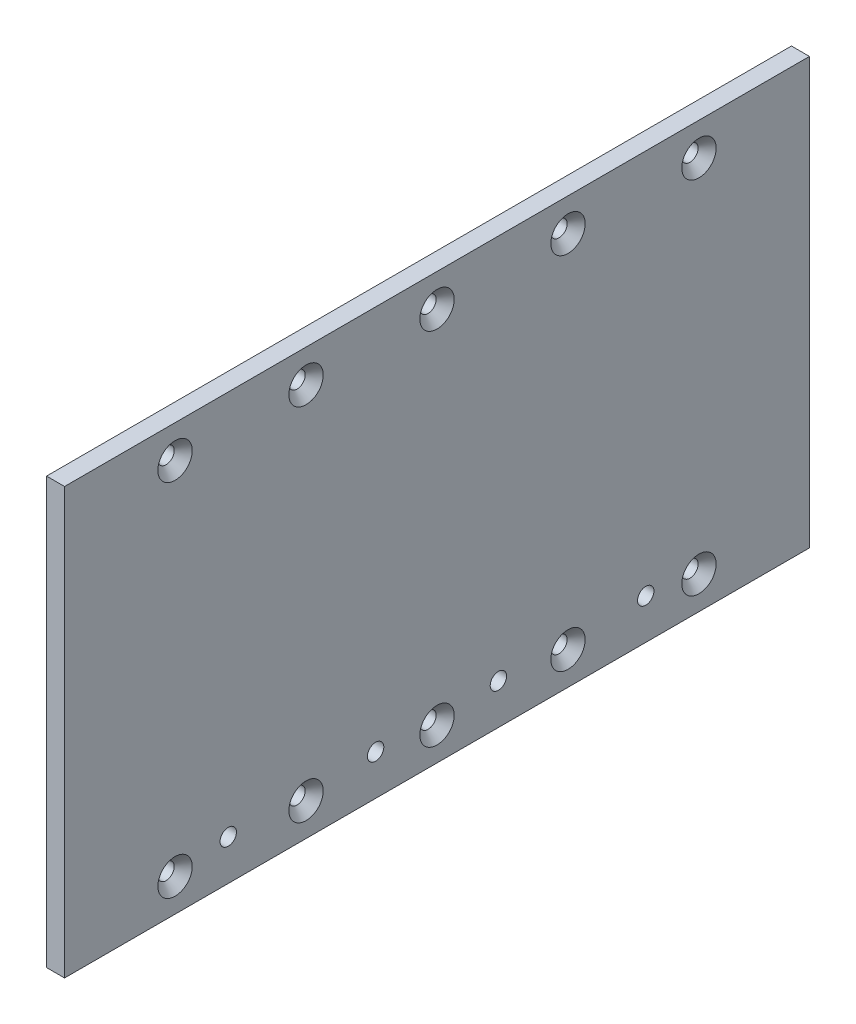
ISO-10303-21;
HEADER;
FILE_DESCRIPTION(('STEP AP214'),'2;1');
FILE_NAME('part.step','',(''),(''),'','','');
FILE_SCHEMA(('AUTOMOTIVE_DESIGN { 1 0 10303 214 1 1 1 1 }'));
ENDSEC;
DATA;
#1=APPLICATION_CONTEXT('core data for automotive mechanical design processes');
#2=APPLICATION_PROTOCOL_DEFINITION('international standard','automotive_design',2000,#1);
#3=PRODUCT_CONTEXT('',#1,'mechanical');
#4=PRODUCT('Part','Part','',(#3));
#5=PRODUCT_RELATED_PRODUCT_CATEGORY('part','',(#4));
#6=PRODUCT_DEFINITION_FORMATION('','',#4);
#7=PRODUCT_DEFINITION_CONTEXT('part definition',#1,'design');
#8=PRODUCT_DEFINITION('design','',#6,#7);
#9=PRODUCT_DEFINITION_SHAPE('','',#8);
#10=(LENGTH_UNIT() NAMED_UNIT(*) SI_UNIT(.MILLI.,.METRE.));
#11=(NAMED_UNIT(*) PLANE_ANGLE_UNIT() SI_UNIT($,.RADIAN.));
#12=(NAMED_UNIT(*) SI_UNIT($,.STERADIAN.) SOLID_ANGLE_UNIT());
#13=UNCERTAINTY_MEASURE_WITH_UNIT(LENGTH_MEASURE(1.E-05),#10,'distance_accuracy_value','');
#14=(GEOMETRIC_REPRESENTATION_CONTEXT(3) GLOBAL_UNCERTAINTY_ASSIGNED_CONTEXT((#13)) GLOBAL_UNIT_ASSIGNED_CONTEXT((#10,
#11,#12)) REPRESENTATION_CONTEXT('',''));
#15=CARTESIAN_POINT('',(0.,0.,0.));
#16=DIRECTION('',(0.,0.,1.));
#17=DIRECTION('',(1.,0.,0.));
#18=AXIS2_PLACEMENT_3D('',#15,#16,#17);
#19=CARTESIAN_POINT('',(5.5,-65.,113.75));
#20=DIRECTION('',(0.,0.,-1.));
#21=DIRECTION('',(-1.,0.,0.));
#22=AXIS2_PLACEMENT_3D('',#19,#20,#21);
#23=PLANE('',#22);
#24=DIRECTION('',(0.,-1.,0.));
#25=VECTOR('',#24,1.);
#26=CARTESIAN_POINT('',(0.,-65.,113.75));
#27=LINE('',#26,#25);
#28=CARTESIAN_POINT('',(0.,65.,113.75));
#29=VERTEX_POINT('',#28);
#30=CARTESIAN_POINT('',(0.,-65.,113.75));
#31=VERTEX_POINT('',#30);
#32=EDGE_CURVE('E108',#29,#31,#27,.T.);
#33=ORIENTED_EDGE('',*,*,#32,.T.);
#34=DIRECTION('',(-1.,0.,0.));
#35=VECTOR('',#34,1.);
#36=CARTESIAN_POINT('',(5.5,-65.,113.75));
#37=LINE('',#36,#35);
#38=CARTESIAN_POINT('',(5.5,-65.,113.75));
#39=VERTEX_POINT('',#38);
#40=EDGE_CURVE('E13',#39,#31,#37,.T.);
#41=ORIENTED_EDGE('',*,*,#40,.F.);
#42=DIRECTION('',(0.,-1.,0.));
#43=VECTOR('',#42,1.);
#44=CARTESIAN_POINT('',(5.5,-65.,113.75));
#45=LINE('',#44,#43);
#46=CARTESIAN_POINT('',(5.5,65.,113.75));
#47=VERTEX_POINT('',#46);
#48=EDGE_CURVE('E96',#47,#39,#45,.T.);
#49=ORIENTED_EDGE('',*,*,#48,.F.);
#50=DIRECTION('',(-1.,0.,0.));
#51=VECTOR('',#50,1.);
#52=CARTESIAN_POINT('',(5.5,65.,113.75));
#53=LINE('',#52,#51);
#54=EDGE_CURVE('E104',#47,#29,#53,.T.);
#55=ORIENTED_EDGE('',*,*,#54,.T.);
#56=EDGE_LOOP('',(#33,#41,#49,#55));
#57=FACE_BOUND('',#56,.T.);
#58=ADVANCED_FACE('F45',(#57),#23,.F.);
#59=CARTESIAN_POINT('',(5.5,-65.,-113.75));
#60=DIRECTION('',(0.,1.,0.));
#61=DIRECTION('',(0.,0.,1.));
#62=AXIS2_PLACEMENT_3D('',#59,#60,#61);
#63=PLANE('',#62);
#64=DIRECTION('',(0.,0.,-1.));
#65=VECTOR('',#64,1.);
#66=CARTESIAN_POINT('',(0.,-65.,-113.75));
#67=LINE('',#66,#65);
#68=CARTESIAN_POINT('',(0.,-65.,-113.75));
#69=VERTEX_POINT('',#68);
#70=EDGE_CURVE('E100',#31,#69,#67,.T.);
#71=ORIENTED_EDGE('',*,*,#70,.T.);
#72=DIRECTION('',(-1.,0.,0.));
#73=VECTOR('',#72,1.);
#74=CARTESIAN_POINT('',(5.5,-65.,-113.75));
#75=LINE('',#74,#73);
#76=CARTESIAN_POINT('',(5.5,-65.,-113.75));
#77=VERTEX_POINT('',#76);
#78=EDGE_CURVE('E53',#77,#69,#75,.T.);
#79=ORIENTED_EDGE('',*,*,#78,.F.);
#80=DIRECTION('',(0.,0.,-1.));
#81=VECTOR('',#80,1.);
#82=CARTESIAN_POINT('',(5.5,-65.,-113.75));
#83=LINE('',#82,#81);
#84=EDGE_CURVE('E91',#39,#77,#83,.T.);
#85=ORIENTED_EDGE('',*,*,#84,.F.);
#86=ORIENTED_EDGE('',*,*,#40,.T.);
#87=EDGE_LOOP('',(#71,#79,#85,#86));
#88=FACE_BOUND('',#87,.T.);
#89=ADVANCED_FACE('F99',(#88),#63,.F.);
#90=CARTESIAN_POINT('',(5.5,-65.,-113.75));
#91=DIRECTION('',(0.,0.,1.));
#92=DIRECTION('',(1.,0.,0.));
#93=AXIS2_PLACEMENT_3D('',#90,#91,#92);
#94=PLANE('',#93);
#95=DIRECTION('',(0.,1.,0.));
#96=VECTOR('',#95,1.);
#97=CARTESIAN_POINT('',(0.,-65.,-113.75));
#98=LINE('',#97,#96);
#99=CARTESIAN_POINT('',(0.,65.,-113.75));
#100=VERTEX_POINT('',#99);
#101=EDGE_CURVE('E78',#69,#100,#98,.T.);
#102=ORIENTED_EDGE('',*,*,#101,.T.);
#103=DIRECTION('',(-1.,0.,0.));
#104=VECTOR('',#103,1.);
#105=CARTESIAN_POINT('',(5.5,65.,-113.75));
#106=LINE('',#105,#104);
#107=CARTESIAN_POINT('',(5.5,65.,-113.75));
#108=VERTEX_POINT('',#107);
#109=EDGE_CURVE('E101',#108,#100,#106,.T.);
#110=ORIENTED_EDGE('',*,*,#109,.F.);
#111=DIRECTION('',(0.,1.,0.));
#112=VECTOR('',#111,1.);
#113=CARTESIAN_POINT('',(5.5,-65.,-113.75));
#114=LINE('',#113,#112);
#115=EDGE_CURVE('E94',#77,#108,#114,.T.);
#116=ORIENTED_EDGE('',*,*,#115,.F.);
#117=ORIENTED_EDGE('',*,*,#78,.T.);
#118=EDGE_LOOP('',(#102,#110,#116,#117));
#119=FACE_BOUND('',#118,.T.);
#120=ADVANCED_FACE('F102',(#119),#94,.F.);
#121=CARTESIAN_POINT('',(5.5,65.,-113.75));
#122=DIRECTION('',(0.,-1.,0.));
#123=DIRECTION('',(0.,0.,-1.));
#124=AXIS2_PLACEMENT_3D('',#121,#122,#123);
#125=PLANE('',#124);
#126=DIRECTION('',(0.,0.,1.));
#127=VECTOR('',#126,1.);
#128=CARTESIAN_POINT('',(0.,65.,-113.75));
#129=LINE('',#128,#127);
#130=EDGE_CURVE('E84',#100,#29,#129,.T.);
#131=ORIENTED_EDGE('',*,*,#130,.T.);
#132=ORIENTED_EDGE('',*,*,#54,.F.);
#133=DIRECTION('',(0.,0.,1.));
#134=VECTOR('',#133,1.);
#135=CARTESIAN_POINT('',(5.5,65.,-113.75));
#136=LINE('',#135,#134);
#137=EDGE_CURVE('E61',#108,#47,#136,.T.);
#138=ORIENTED_EDGE('',*,*,#137,.F.);
#139=ORIENTED_EDGE('',*,*,#109,.T.);
#140=EDGE_LOOP('',(#131,#132,#138,#139));
#141=FACE_BOUND('',#140,.T.);
#142=ADVANCED_FACE('F116',(#141),#125,.F.);
#143=CARTESIAN_POINT('',(5.5,0.,0.));
#144=DIRECTION('',(1.,0.,0.));
#145=DIRECTION('',(0.,0.,-1.));
#146=AXIS2_PLACEMENT_3D('',#143,#144,#145);
#147=PLANE('',#146);
#148=CARTESIAN_POINT('',(5.5,-52.6538368417559,63.75));
#149=DIRECTION('',(1.,0.,0.));
#150=DIRECTION('',(0.,0.,-1.));
#151=AXIS2_PLACEMENT_3D('',#148,#149,#150);
#152=CIRCLE('',#151,2.49999999999999);
#153=CARTESIAN_POINT('',(5.5,-52.6538368417559,61.25));
#154=VERTEX_POINT('',#153);
#155=EDGE_CURVE('E232',#154,#154,#152,.T.);
#156=ORIENTED_EDGE('',*,*,#155,.F.);
#157=EDGE_LOOP('',(#156));
#158=FACE_BOUND('',#157,.T.);
#159=CARTESIAN_POINT('',(5.5,-52.6538368417559,18.75));
#160=DIRECTION('',(1.,0.,0.));
#161=DIRECTION('',(0.,0.,-1.));
#162=AXIS2_PLACEMENT_3D('',#159,#160,#161);
#163=CIRCLE('',#162,2.49999999999999);
#164=CARTESIAN_POINT('',(5.5,-52.6538368417559,16.2500000000001));
#165=VERTEX_POINT('',#164);
#166=EDGE_CURVE('E226',#165,#165,#163,.T.);
#167=ORIENTED_EDGE('',*,*,#166,.F.);
#168=EDGE_LOOP('',(#167));
#169=FACE_BOUND('',#168,.T.);
#170=CARTESIAN_POINT('',(5.5,-52.6538368417559,-18.75));
#171=DIRECTION('',(1.,0.,0.));
#172=DIRECTION('',(0.,0.,-1.));
#173=AXIS2_PLACEMENT_3D('',#170,#171,#172);
#174=CIRCLE('',#173,2.49999999999999);
#175=CARTESIAN_POINT('',(5.5,-52.6538368417559,-21.25));
#176=VERTEX_POINT('',#175);
#177=EDGE_CURVE('E220',#176,#176,#174,.T.);
#178=ORIENTED_EDGE('',*,*,#177,.F.);
#179=EDGE_LOOP('',(#178));
#180=FACE_BOUND('',#179,.T.);
#181=CARTESIAN_POINT('',(5.5,-52.6538368417559,-63.75));
#182=DIRECTION('',(1.,0.,0.));
#183=DIRECTION('',(0.,0.,-1.));
#184=AXIS2_PLACEMENT_3D('',#181,#182,#183);
#185=CIRCLE('',#184,2.49999999999999);
#186=CARTESIAN_POINT('',(5.5,-52.6538368417559,-66.2499999999999));
#187=VERTEX_POINT('',#186);
#188=EDGE_CURVE('E214',#187,#187,#185,.T.);
#189=ORIENTED_EDGE('',*,*,#188,.F.);
#190=EDGE_LOOP('',(#189));
#191=FACE_BOUND('',#190,.T.);
#192=CARTESIAN_POINT('',(5.5,55.,-80.));
#193=DIRECTION('',(1.,0.,0.));
#194=DIRECTION('',(0.,0.,-1.));
#195=AXIS2_PLACEMENT_3D('',#192,#193,#194);
#196=CIRCLE('',#195,5.25);
#197=CARTESIAN_POINT('',(5.5,55.,-85.25));
#198=VERTEX_POINT('',#197);
#199=EDGE_CURVE('E208',#198,#198,#196,.T.);
#200=ORIENTED_EDGE('',*,*,#199,.F.);
#201=EDGE_LOOP('',(#200));
#202=FACE_BOUND('',#201,.T.);
#203=CARTESIAN_POINT('',(5.5,55.,-40.));
#204=DIRECTION('',(1.,0.,0.));
#205=DIRECTION('',(0.,0.,-1.));
#206=AXIS2_PLACEMENT_3D('',#203,#204,#205);
#207=CIRCLE('',#206,5.25);
#208=CARTESIAN_POINT('',(5.5,55.,-45.25));
#209=VERTEX_POINT('',#208);
#210=EDGE_CURVE('E199',#209,#209,#207,.T.);
#211=ORIENTED_EDGE('',*,*,#210,.F.);
#212=EDGE_LOOP('',(#211));
#213=FACE_BOUND('',#212,.T.);
#214=CARTESIAN_POINT('',(5.5,55.,0.));
#215=DIRECTION('',(1.,0.,0.));
#216=DIRECTION('',(0.,0.,-1.));
#217=AXIS2_PLACEMENT_3D('',#214,#215,#216);
#218=CIRCLE('',#217,5.25);
#219=CARTESIAN_POINT('',(5.5,55.,-5.25));
#220=VERTEX_POINT('',#219);
#221=EDGE_CURVE('E190',#220,#220,#218,.T.);
#222=ORIENTED_EDGE('',*,*,#221,.F.);
#223=EDGE_LOOP('',(#222));
#224=FACE_BOUND('',#223,.T.);
#225=CARTESIAN_POINT('',(5.5,54.9999999999999,40.));
#226=DIRECTION('',(1.,0.,0.));
#227=DIRECTION('',(0.,0.,-1.));
#228=AXIS2_PLACEMENT_3D('',#225,#226,#227);
#229=CIRCLE('',#228,5.25);
#230=CARTESIAN_POINT('',(5.5,54.9999999999999,34.75));
#231=VERTEX_POINT('',#230);
#232=EDGE_CURVE('E181',#231,#231,#229,.T.);
#233=ORIENTED_EDGE('',*,*,#232,.F.);
#234=EDGE_LOOP('',(#233));
#235=FACE_BOUND('',#234,.T.);
#236=CARTESIAN_POINT('',(5.5,54.9999999999999,80.));
#237=DIRECTION('',(1.,0.,0.));
#238=DIRECTION('',(0.,0.,-1.));
#239=AXIS2_PLACEMENT_3D('',#236,#237,#238);
#240=CIRCLE('',#239,5.25);
#241=CARTESIAN_POINT('',(5.5,54.9999999999999,74.75));
#242=VERTEX_POINT('',#241);
#243=EDGE_CURVE('E172',#242,#242,#240,.T.);
#244=ORIENTED_EDGE('',*,*,#243,.F.);
#245=EDGE_LOOP('',(#244));
#246=FACE_BOUND('',#245,.T.);
#247=CARTESIAN_POINT('',(5.5,-55.0000000000001,80.));
#248=DIRECTION('',(1.,0.,0.));
#249=DIRECTION('',(0.,0.,-1.));
#250=AXIS2_PLACEMENT_3D('',#247,#248,#249);
#251=CIRCLE('',#250,5.25);
#252=CARTESIAN_POINT('',(5.5,-55.0000000000001,74.75));
#253=VERTEX_POINT('',#252);
#254=EDGE_CURVE('E163',#253,#253,#251,.T.);
#255=ORIENTED_EDGE('',*,*,#254,.F.);
#256=EDGE_LOOP('',(#255));
#257=FACE_BOUND('',#256,.T.);
#258=CARTESIAN_POINT('',(5.5,-55.0000000000001,40.));
#259=DIRECTION('',(1.,0.,0.));
#260=DIRECTION('',(0.,0.,-1.));
#261=AXIS2_PLACEMENT_3D('',#258,#259,#260);
#262=CIRCLE('',#261,5.25);
#263=CARTESIAN_POINT('',(5.5,-55.0000000000001,34.75));
#264=VERTEX_POINT('',#263);
#265=EDGE_CURVE('E154',#264,#264,#262,.T.);
#266=ORIENTED_EDGE('',*,*,#265,.F.);
#267=EDGE_LOOP('',(#266));
#268=FACE_BOUND('',#267,.T.);
#269=CARTESIAN_POINT('',(5.5,-55.0000000000001,0.));
#270=DIRECTION('',(1.,0.,0.));
#271=DIRECTION('',(0.,0.,-1.));
#272=AXIS2_PLACEMENT_3D('',#269,#270,#271);
#273=CIRCLE('',#272,5.25);
#274=CARTESIAN_POINT('',(5.5,-55.0000000000001,-5.25000000000001));
#275=VERTEX_POINT('',#274);
#276=EDGE_CURVE('E145',#275,#275,#273,.T.);
#277=ORIENTED_EDGE('',*,*,#276,.F.);
#278=EDGE_LOOP('',(#277));
#279=FACE_BOUND('',#278,.T.);
#280=CARTESIAN_POINT('',(5.5,-55.,-40.));
#281=DIRECTION('',(1.,0.,0.));
#282=DIRECTION('',(0.,0.,-1.));
#283=AXIS2_PLACEMENT_3D('',#280,#281,#282);
#284=CIRCLE('',#283,5.25);
#285=CARTESIAN_POINT('',(5.5,-55.,-45.25));
#286=VERTEX_POINT('',#285);
#287=EDGE_CURVE('E136',#286,#286,#284,.T.);
#288=ORIENTED_EDGE('',*,*,#287,.F.);
#289=EDGE_LOOP('',(#288));
#290=FACE_BOUND('',#289,.T.);
#291=CARTESIAN_POINT('',(5.5,-55.,-80.));
#292=DIRECTION('',(1.,0.,0.));
#293=DIRECTION('',(0.,0.,-1.));
#294=AXIS2_PLACEMENT_3D('',#291,#292,#293);
#295=CIRCLE('',#294,5.25);
#296=CARTESIAN_POINT('',(5.5,-55.,-85.25));
#297=VERTEX_POINT('',#296);
#298=EDGE_CURVE('E127',#297,#297,#295,.T.);
#299=ORIENTED_EDGE('',*,*,#298,.F.);
#300=EDGE_LOOP('',(#299));
#301=FACE_BOUND('',#300,.T.);
#302=ORIENTED_EDGE('',*,*,#48,.T.);
#303=ORIENTED_EDGE('',*,*,#84,.T.);
#304=ORIENTED_EDGE('',*,*,#115,.T.);
#305=ORIENTED_EDGE('',*,*,#137,.T.);
#306=EDGE_LOOP('',(#302,#303,#304,#305));
#307=FACE_BOUND('',#306,.T.);
#308=ADVANCED_FACE('F92',(#158,#169,#180,#191,#202,#213,#224,#235,#246,#257,#268,#279,#290,#301,
#307),#147,.T.);
#309=CARTESIAN_POINT('',(0.,0.,0.));
#310=DIRECTION('',(1.,0.,0.));
#311=DIRECTION('',(0.,0.,-1.));
#312=AXIS2_PLACEMENT_3D('',#309,#310,#311);
#313=PLANE('',#312);
#314=CARTESIAN_POINT('',(0.,-52.6538368417559,63.75));
#315=DIRECTION('',(1.,0.,0.));
#316=DIRECTION('',(0.,0.,-1.));
#317=AXIS2_PLACEMENT_3D('',#314,#315,#316);
#318=CIRCLE('',#317,2.49999999999999);
#319=CARTESIAN_POINT('',(0.,-52.6538368417559,61.25));
#320=VERTEX_POINT('',#319);
#321=EDGE_CURVE('E229',#320,#320,#318,.T.);
#322=ORIENTED_EDGE('',*,*,#321,.T.);
#323=EDGE_LOOP('',(#322));
#324=FACE_BOUND('',#323,.T.);
#325=CARTESIAN_POINT('',(0.,-52.6538368417559,18.75));
#326=DIRECTION('',(1.,0.,0.));
#327=DIRECTION('',(0.,0.,-1.));
#328=AXIS2_PLACEMENT_3D('',#325,#326,#327);
#329=CIRCLE('',#328,2.49999999999999);
#330=CARTESIAN_POINT('',(0.,-52.6538368417559,16.2500000000001));
#331=VERTEX_POINT('',#330);
#332=EDGE_CURVE('E223',#331,#331,#329,.T.);
#333=ORIENTED_EDGE('',*,*,#332,.T.);
#334=EDGE_LOOP('',(#333));
#335=FACE_BOUND('',#334,.T.);
#336=CARTESIAN_POINT('',(0.,-52.6538368417559,-18.75));
#337=DIRECTION('',(1.,0.,0.));
#338=DIRECTION('',(0.,0.,-1.));
#339=AXIS2_PLACEMENT_3D('',#336,#337,#338);
#340=CIRCLE('',#339,2.49999999999999);
#341=CARTESIAN_POINT('',(0.,-52.6538368417559,-21.25));
#342=VERTEX_POINT('',#341);
#343=EDGE_CURVE('E217',#342,#342,#340,.T.);
#344=ORIENTED_EDGE('',*,*,#343,.T.);
#345=EDGE_LOOP('',(#344));
#346=FACE_BOUND('',#345,.T.);
#347=CARTESIAN_POINT('',(0.,-52.6538368417559,-63.75));
#348=DIRECTION('',(1.,0.,0.));
#349=DIRECTION('',(0.,0.,-1.));
#350=AXIS2_PLACEMENT_3D('',#347,#348,#349);
#351=CIRCLE('',#350,2.49999999999999);
#352=CARTESIAN_POINT('',(0.,-52.6538368417559,-66.2499999999999));
#353=VERTEX_POINT('',#352);
#354=EDGE_CURVE('E211',#353,#353,#351,.T.);
#355=ORIENTED_EDGE('',*,*,#354,.T.);
#356=EDGE_LOOP('',(#355));
#357=FACE_BOUND('',#356,.T.);
#358=CARTESIAN_POINT('',(0.,55.,-80.));
#359=DIRECTION('',(1.,0.,0.));
#360=DIRECTION('',(0.,0.,-1.));
#361=AXIS2_PLACEMENT_3D('',#358,#359,#360);
#362=CIRCLE('',#361,2.5);
#363=CARTESIAN_POINT('',(0.,55.,-82.5));
#364=VERTEX_POINT('',#363);
#365=EDGE_CURVE('E202',#364,#364,#362,.T.);
#366=ORIENTED_EDGE('',*,*,#365,.T.);
#367=EDGE_LOOP('',(#366));
#368=FACE_BOUND('',#367,.T.);
#369=CARTESIAN_POINT('',(0.,55.,-40.));
#370=DIRECTION('',(1.,0.,0.));
#371=DIRECTION('',(0.,0.,-1.));
#372=AXIS2_PLACEMENT_3D('',#369,#370,#371);
#373=CIRCLE('',#372,2.5);
#374=CARTESIAN_POINT('',(0.,55.,-42.5));
#375=VERTEX_POINT('',#374);
#376=EDGE_CURVE('E193',#375,#375,#373,.T.);
#377=ORIENTED_EDGE('',*,*,#376,.T.);
#378=EDGE_LOOP('',(#377));
#379=FACE_BOUND('',#378,.T.);
#380=CARTESIAN_POINT('',(0.,55.,0.));
#381=DIRECTION('',(1.,0.,0.));
#382=DIRECTION('',(0.,0.,-1.));
#383=AXIS2_PLACEMENT_3D('',#380,#381,#382);
#384=CIRCLE('',#383,2.5);
#385=CARTESIAN_POINT('',(0.,55.,-2.5));
#386=VERTEX_POINT('',#385);
#387=EDGE_CURVE('E184',#386,#386,#384,.T.);
#388=ORIENTED_EDGE('',*,*,#387,.T.);
#389=EDGE_LOOP('',(#388));
#390=FACE_BOUND('',#389,.T.);
#391=CARTESIAN_POINT('',(0.,54.9999999999999,40.));
#392=DIRECTION('',(1.,0.,0.));
#393=DIRECTION('',(0.,0.,-1.));
#394=AXIS2_PLACEMENT_3D('',#391,#392,#393);
#395=CIRCLE('',#394,2.5);
#396=CARTESIAN_POINT('',(0.,54.9999999999999,37.5));
#397=VERTEX_POINT('',#396);
#398=EDGE_CURVE('E175',#397,#397,#395,.T.);
#399=ORIENTED_EDGE('',*,*,#398,.T.);
#400=EDGE_LOOP('',(#399));
#401=FACE_BOUND('',#400,.T.);
#402=CARTESIAN_POINT('',(0.,54.9999999999999,80.));
#403=DIRECTION('',(1.,0.,0.));
#404=DIRECTION('',(0.,0.,-1.));
#405=AXIS2_PLACEMENT_3D('',#402,#403,#404);
#406=CIRCLE('',#405,2.5);
#407=CARTESIAN_POINT('',(0.,54.9999999999999,77.5));
#408=VERTEX_POINT('',#407);
#409=EDGE_CURVE('E166',#408,#408,#406,.T.);
#410=ORIENTED_EDGE('',*,*,#409,.T.);
#411=EDGE_LOOP('',(#410));
#412=FACE_BOUND('',#411,.T.);
#413=CARTESIAN_POINT('',(0.,-55.0000000000001,80.));
#414=DIRECTION('',(1.,0.,0.));
#415=DIRECTION('',(0.,0.,-1.));
#416=AXIS2_PLACEMENT_3D('',#413,#414,#415);
#417=CIRCLE('',#416,2.5);
#418=CARTESIAN_POINT('',(0.,-55.0000000000001,77.5));
#419=VERTEX_POINT('',#418);
#420=EDGE_CURVE('E157',#419,#419,#417,.T.);
#421=ORIENTED_EDGE('',*,*,#420,.T.);
#422=EDGE_LOOP('',(#421));
#423=FACE_BOUND('',#422,.T.);
#424=CARTESIAN_POINT('',(0.,-55.0000000000001,40.));
#425=DIRECTION('',(1.,0.,0.));
#426=DIRECTION('',(0.,0.,-1.));
#427=AXIS2_PLACEMENT_3D('',#424,#425,#426);
#428=CIRCLE('',#427,2.5);
#429=CARTESIAN_POINT('',(0.,-55.0000000000001,37.5));
#430=VERTEX_POINT('',#429);
#431=EDGE_CURVE('E148',#430,#430,#428,.T.);
#432=ORIENTED_EDGE('',*,*,#431,.T.);
#433=EDGE_LOOP('',(#432));
#434=FACE_BOUND('',#433,.T.);
#435=CARTESIAN_POINT('',(0.,-55.0000000000001,0.));
#436=DIRECTION('',(1.,0.,0.));
#437=DIRECTION('',(0.,0.,-1.));
#438=AXIS2_PLACEMENT_3D('',#435,#436,#437);
#439=CIRCLE('',#438,2.5);
#440=CARTESIAN_POINT('',(0.,-55.0000000000001,-2.50000000000001));
#441=VERTEX_POINT('',#440);
#442=EDGE_CURVE('E139',#441,#441,#439,.T.);
#443=ORIENTED_EDGE('',*,*,#442,.T.);
#444=EDGE_LOOP('',(#443));
#445=FACE_BOUND('',#444,.T.);
#446=CARTESIAN_POINT('',(0.,-55.,-40.));
#447=DIRECTION('',(1.,0.,0.));
#448=DIRECTION('',(0.,0.,-1.));
#449=AXIS2_PLACEMENT_3D('',#446,#447,#448);
#450=CIRCLE('',#449,2.5);
#451=CARTESIAN_POINT('',(0.,-55.,-42.5));
#452=VERTEX_POINT('',#451);
#453=EDGE_CURVE('E130',#452,#452,#450,.T.);
#454=ORIENTED_EDGE('',*,*,#453,.T.);
#455=EDGE_LOOP('',(#454));
#456=FACE_BOUND('',#455,.T.);
#457=CARTESIAN_POINT('',(0.,-55.,-80.));
#458=DIRECTION('',(1.,0.,0.));
#459=DIRECTION('',(0.,0.,-1.));
#460=AXIS2_PLACEMENT_3D('',#457,#458,#459);
#461=CIRCLE('',#460,2.5);
#462=CARTESIAN_POINT('',(0.,-55.,-82.5));
#463=VERTEX_POINT('',#462);
#464=EDGE_CURVE('E111',#463,#463,#461,.T.);
#465=ORIENTED_EDGE('',*,*,#464,.T.);
#466=EDGE_LOOP('',(#465));
#467=FACE_BOUND('',#466,.T.);
#468=ORIENTED_EDGE('',*,*,#32,.F.);
#469=ORIENTED_EDGE('',*,*,#130,.F.);
#470=ORIENTED_EDGE('',*,*,#101,.F.);
#471=ORIENTED_EDGE('',*,*,#70,.F.);
#472=EDGE_LOOP('',(#468,#469,#470,#471));
#473=FACE_BOUND('',#472,.T.);
#474=ADVANCED_FACE('F119',(#324,#335,#346,#357,#368,#379,#390,#401,#412,#423,#434,#445,#456,
#467,#473),#313,.F.);
#475=CARTESIAN_POINT('',(5.5,-55.,-80.));
#476=DIRECTION('',(1.,0.,0.));
#477=DIRECTION('',(0.,0.,-1.));
#478=AXIS2_PLACEMENT_3D('',#475,#476,#477);
#479=CYLINDRICAL_SURFACE('',#478,2.5);
#480=ORIENTED_EDGE('',*,*,#464,.F.);
#481=EDGE_LOOP('',(#480));
#482=FACE_BOUND('',#481,.T.);
#483=CARTESIAN_POINT('',(2.75,-55.,-80.));
#484=DIRECTION('',(1.,0.,0.));
#485=DIRECTION('',(0.,0.,-1.));
#486=AXIS2_PLACEMENT_3D('',#483,#484,#485);
#487=CIRCLE('',#486,2.5);
#488=CARTESIAN_POINT('',(2.75,-55.,-82.5));
#489=VERTEX_POINT('',#488);
#490=EDGE_CURVE('E124',#489,#489,#487,.T.);
#491=ORIENTED_EDGE('',*,*,#490,.T.);
#492=EDGE_LOOP('',(#491));
#493=FACE_BOUND('',#492,.T.);
#494=ADVANCED_FACE('F270',(#482,#493),#479,.F.);
#495=CARTESIAN_POINT('',(5.5,-55.,-80.));
#496=DIRECTION('',(1.,0.,0.));
#497=DIRECTION('',(0.,0.,-1.));
#498=AXIS2_PLACEMENT_3D('',#495,#496,#497);
#499=CONICAL_SURFACE('',#498,5.25,0.785398163397448);
#500=ORIENTED_EDGE('',*,*,#490,.F.);
#501=EDGE_LOOP('',(#500));
#502=FACE_BOUND('',#501,.T.);
#503=ORIENTED_EDGE('',*,*,#298,.T.);
#504=EDGE_LOOP('',(#503));
#505=FACE_BOUND('',#504,.T.);
#506=ADVANCED_FACE('F267',(#502,#505),#499,.F.);
#507=CARTESIAN_POINT('',(5.5,-55.,-40.));
#508=DIRECTION('',(1.,0.,0.));
#509=DIRECTION('',(0.,0.,-1.));
#510=AXIS2_PLACEMENT_3D('',#507,#508,#509);
#511=CYLINDRICAL_SURFACE('',#510,2.5);
#512=ORIENTED_EDGE('',*,*,#453,.F.);
#513=EDGE_LOOP('',(#512));
#514=FACE_BOUND('',#513,.T.);
#515=CARTESIAN_POINT('',(2.75,-55.,-40.));
#516=DIRECTION('',(1.,0.,0.));
#517=DIRECTION('',(0.,0.,-1.));
#518=AXIS2_PLACEMENT_3D('',#515,#516,#517);
#519=CIRCLE('',#518,2.5);
#520=CARTESIAN_POINT('',(2.75,-55.,-42.5));
#521=VERTEX_POINT('',#520);
#522=EDGE_CURVE('E133',#521,#521,#519,.T.);
#523=ORIENTED_EDGE('',*,*,#522,.T.);
#524=EDGE_LOOP('',(#523));
#525=FACE_BOUND('',#524,.T.);
#526=ADVANCED_FACE('F269',(#514,#525),#511,.F.);
#527=CARTESIAN_POINT('',(5.5,-55.,-40.));
#528=DIRECTION('',(1.,0.,0.));
#529=DIRECTION('',(0.,0.,-1.));
#530=AXIS2_PLACEMENT_3D('',#527,#528,#529);
#531=CONICAL_SURFACE('',#530,5.25,0.785398163397448);
#532=ORIENTED_EDGE('',*,*,#522,.F.);
#533=EDGE_LOOP('',(#532));
#534=FACE_BOUND('',#533,.T.);
#535=ORIENTED_EDGE('',*,*,#287,.T.);
#536=EDGE_LOOP('',(#535));
#537=FACE_BOUND('',#536,.T.);
#538=ADVANCED_FACE('F277',(#534,#537),#531,.F.);
#539=CARTESIAN_POINT('',(5.5,-55.0000000000001,0.));
#540=DIRECTION('',(1.,0.,0.));
#541=DIRECTION('',(0.,0.,-1.));
#542=AXIS2_PLACEMENT_3D('',#539,#540,#541);
#543=CYLINDRICAL_SURFACE('',#542,2.5);
#544=ORIENTED_EDGE('',*,*,#442,.F.);
#545=EDGE_LOOP('',(#544));
#546=FACE_BOUND('',#545,.T.);
#547=CARTESIAN_POINT('',(2.75,-55.0000000000001,0.));
#548=DIRECTION('',(1.,0.,0.));
#549=DIRECTION('',(0.,0.,-1.));
#550=AXIS2_PLACEMENT_3D('',#547,#548,#549);
#551=CIRCLE('',#550,2.5);
#552=CARTESIAN_POINT('',(2.75,-55.0000000000001,-2.50000000000002));
#553=VERTEX_POINT('',#552);
#554=EDGE_CURVE('E142',#553,#553,#551,.T.);
#555=ORIENTED_EDGE('',*,*,#554,.T.);
#556=EDGE_LOOP('',(#555));
#557=FACE_BOUND('',#556,.T.);
#558=ADVANCED_FACE('F331',(#546,#557),#543,.F.);
#559=CARTESIAN_POINT('',(5.5,-55.0000000000001,0.));
#560=DIRECTION('',(1.,0.,0.));
#561=DIRECTION('',(0.,0.,-1.));
#562=AXIS2_PLACEMENT_3D('',#559,#560,#561);
#563=CONICAL_SURFACE('',#562,5.25,0.785398163397448);
#564=ORIENTED_EDGE('',*,*,#554,.F.);
#565=EDGE_LOOP('',(#564));
#566=FACE_BOUND('',#565,.T.);
#567=ORIENTED_EDGE('',*,*,#276,.T.);
#568=EDGE_LOOP('',(#567));
#569=FACE_BOUND('',#568,.T.);
#570=ADVANCED_FACE('F336',(#566,#569),#563,.F.);
#571=CARTESIAN_POINT('',(5.5,-55.0000000000001,40.));
#572=DIRECTION('',(1.,0.,0.));
#573=DIRECTION('',(0.,0.,-1.));
#574=AXIS2_PLACEMENT_3D('',#571,#572,#573);
#575=CYLINDRICAL_SURFACE('',#574,2.5);
#576=ORIENTED_EDGE('',*,*,#431,.F.);
#577=EDGE_LOOP('',(#576));
#578=FACE_BOUND('',#577,.T.);
#579=CARTESIAN_POINT('',(2.75,-55.0000000000001,40.));
#580=DIRECTION('',(1.,0.,0.));
#581=DIRECTION('',(0.,0.,-1.));
#582=AXIS2_PLACEMENT_3D('',#579,#580,#581);
#583=CIRCLE('',#582,2.5);
#584=CARTESIAN_POINT('',(2.75,-55.0000000000001,37.5));
#585=VERTEX_POINT('',#584);
#586=EDGE_CURVE('E151',#585,#585,#583,.T.);
#587=ORIENTED_EDGE('',*,*,#586,.T.);
#588=EDGE_LOOP('',(#587));
#589=FACE_BOUND('',#588,.T.);
#590=ADVANCED_FACE('F342',(#578,#589),#575,.F.);
#591=CARTESIAN_POINT('',(5.5,-55.0000000000001,40.));
#592=DIRECTION('',(1.,0.,0.));
#593=DIRECTION('',(0.,0.,-1.));
#594=AXIS2_PLACEMENT_3D('',#591,#592,#593);
#595=CONICAL_SURFACE('',#594,5.25,0.785398163397448);
#596=ORIENTED_EDGE('',*,*,#586,.F.);
#597=EDGE_LOOP('',(#596));
#598=FACE_BOUND('',#597,.T.);
#599=ORIENTED_EDGE('',*,*,#265,.T.);
#600=EDGE_LOOP('',(#599));
#601=FACE_BOUND('',#600,.T.);
#602=ADVANCED_FACE('F346',(#598,#601),#595,.F.);
#603=CARTESIAN_POINT('',(5.5,-55.0000000000001,80.));
#604=DIRECTION('',(1.,0.,0.));
#605=DIRECTION('',(0.,0.,-1.));
#606=AXIS2_PLACEMENT_3D('',#603,#604,#605);
#607=CYLINDRICAL_SURFACE('',#606,2.5);
#608=ORIENTED_EDGE('',*,*,#420,.F.);
#609=EDGE_LOOP('',(#608));
#610=FACE_BOUND('',#609,.T.);
#611=CARTESIAN_POINT('',(2.75,-55.0000000000001,80.));
#612=DIRECTION('',(1.,0.,0.));
#613=DIRECTION('',(0.,0.,-1.));
#614=AXIS2_PLACEMENT_3D('',#611,#612,#613);
#615=CIRCLE('',#614,2.5);
#616=CARTESIAN_POINT('',(2.75,-55.0000000000001,77.5));
#617=VERTEX_POINT('',#616);
#618=EDGE_CURVE('E160',#617,#617,#615,.T.);
#619=ORIENTED_EDGE('',*,*,#618,.T.);
#620=EDGE_LOOP('',(#619));
#621=FACE_BOUND('',#620,.T.);
#622=ADVANCED_FACE('F350',(#610,#621),#607,.F.);
#623=CARTESIAN_POINT('',(5.5,-55.0000000000001,80.));
#624=DIRECTION('',(1.,0.,0.));
#625=DIRECTION('',(0.,0.,-1.));
#626=AXIS2_PLACEMENT_3D('',#623,#624,#625);
#627=CONICAL_SURFACE('',#626,5.25,0.785398163397448);
#628=ORIENTED_EDGE('',*,*,#618,.F.);
#629=EDGE_LOOP('',(#628));
#630=FACE_BOUND('',#629,.T.);
#631=ORIENTED_EDGE('',*,*,#254,.T.);
#632=EDGE_LOOP('',(#631));
#633=FACE_BOUND('',#632,.T.);
#634=ADVANCED_FACE('F354',(#630,#633),#627,.F.);
#635=CARTESIAN_POINT('',(5.5,54.9999999999999,80.));
#636=DIRECTION('',(1.,0.,0.));
#637=DIRECTION('',(0.,0.,-1.));
#638=AXIS2_PLACEMENT_3D('',#635,#636,#637);
#639=CYLINDRICAL_SURFACE('',#638,2.5);
#640=ORIENTED_EDGE('',*,*,#409,.F.);
#641=EDGE_LOOP('',(#640));
#642=FACE_BOUND('',#641,.T.);
#643=CARTESIAN_POINT('',(2.75,54.9999999999999,80.));
#644=DIRECTION('',(1.,0.,0.));
#645=DIRECTION('',(0.,0.,-1.));
#646=AXIS2_PLACEMENT_3D('',#643,#644,#645);
#647=CIRCLE('',#646,2.5);
#648=CARTESIAN_POINT('',(2.75,54.9999999999999,77.5));
#649=VERTEX_POINT('',#648);
#650=EDGE_CURVE('E169',#649,#649,#647,.T.);
#651=ORIENTED_EDGE('',*,*,#650,.T.);
#652=EDGE_LOOP('',(#651));
#653=FACE_BOUND('',#652,.T.);
#654=ADVANCED_FACE('F358',(#642,#653),#639,.F.);
#655=CARTESIAN_POINT('',(5.5,54.9999999999999,80.));
#656=DIRECTION('',(1.,0.,0.));
#657=DIRECTION('',(0.,0.,-1.));
#658=AXIS2_PLACEMENT_3D('',#655,#656,#657);
#659=CONICAL_SURFACE('',#658,5.25,0.785398163397448);
#660=ORIENTED_EDGE('',*,*,#650,.F.);
#661=EDGE_LOOP('',(#660));
#662=FACE_BOUND('',#661,.T.);
#663=ORIENTED_EDGE('',*,*,#243,.T.);
#664=EDGE_LOOP('',(#663));
#665=FACE_BOUND('',#664,.T.);
#666=ADVANCED_FACE('F362',(#662,#665),#659,.F.);
#667=CARTESIAN_POINT('',(5.5,54.9999999999999,40.));
#668=DIRECTION('',(1.,0.,0.));
#669=DIRECTION('',(0.,0.,-1.));
#670=AXIS2_PLACEMENT_3D('',#667,#668,#669);
#671=CYLINDRICAL_SURFACE('',#670,2.5);
#672=ORIENTED_EDGE('',*,*,#398,.F.);
#673=EDGE_LOOP('',(#672));
#674=FACE_BOUND('',#673,.T.);
#675=CARTESIAN_POINT('',(2.75,54.9999999999999,40.));
#676=DIRECTION('',(1.,0.,0.));
#677=DIRECTION('',(0.,0.,-1.));
#678=AXIS2_PLACEMENT_3D('',#675,#676,#677);
#679=CIRCLE('',#678,2.5);
#680=CARTESIAN_POINT('',(2.75,54.9999999999999,37.5));
#681=VERTEX_POINT('',#680);
#682=EDGE_CURVE('E178',#681,#681,#679,.T.);
#683=ORIENTED_EDGE('',*,*,#682,.T.);
#684=EDGE_LOOP('',(#683));
#685=FACE_BOUND('',#684,.T.);
#686=ADVANCED_FACE('F366',(#674,#685),#671,.F.);
#687=CARTESIAN_POINT('',(5.5,54.9999999999999,40.));
#688=DIRECTION('',(1.,0.,0.));
#689=DIRECTION('',(0.,0.,-1.));
#690=AXIS2_PLACEMENT_3D('',#687,#688,#689);
#691=CONICAL_SURFACE('',#690,5.25,0.785398163397448);
#692=ORIENTED_EDGE('',*,*,#682,.F.);
#693=EDGE_LOOP('',(#692));
#694=FACE_BOUND('',#693,.T.);
#695=ORIENTED_EDGE('',*,*,#232,.T.);
#696=EDGE_LOOP('',(#695));
#697=FACE_BOUND('',#696,.T.);
#698=ADVANCED_FACE('F370',(#694,#697),#691,.F.);
#699=CARTESIAN_POINT('',(5.5,55.,0.));
#700=DIRECTION('',(1.,0.,0.));
#701=DIRECTION('',(0.,0.,-1.));
#702=AXIS2_PLACEMENT_3D('',#699,#700,#701);
#703=CYLINDRICAL_SURFACE('',#702,2.5);
#704=ORIENTED_EDGE('',*,*,#387,.F.);
#705=EDGE_LOOP('',(#704));
#706=FACE_BOUND('',#705,.T.);
#707=CARTESIAN_POINT('',(2.75,55.,0.));
#708=DIRECTION('',(1.,0.,0.));
#709=DIRECTION('',(0.,0.,-1.));
#710=AXIS2_PLACEMENT_3D('',#707,#708,#709);
#711=CIRCLE('',#710,2.5);
#712=CARTESIAN_POINT('',(2.75,55.,-2.5));
#713=VERTEX_POINT('',#712);
#714=EDGE_CURVE('E187',#713,#713,#711,.T.);
#715=ORIENTED_EDGE('',*,*,#714,.T.);
#716=EDGE_LOOP('',(#715));
#717=FACE_BOUND('',#716,.T.);
#718=ADVANCED_FACE('F374',(#706,#717),#703,.F.);
#719=CARTESIAN_POINT('',(5.5,55.,0.));
#720=DIRECTION('',(1.,0.,0.));
#721=DIRECTION('',(0.,0.,-1.));
#722=AXIS2_PLACEMENT_3D('',#719,#720,#721);
#723=CONICAL_SURFACE('',#722,5.25,0.785398163397448);
#724=ORIENTED_EDGE('',*,*,#714,.F.);
#725=EDGE_LOOP('',(#724));
#726=FACE_BOUND('',#725,.T.);
#727=ORIENTED_EDGE('',*,*,#221,.T.);
#728=EDGE_LOOP('',(#727));
#729=FACE_BOUND('',#728,.T.);
#730=ADVANCED_FACE('F378',(#726,#729),#723,.F.);
#731=CARTESIAN_POINT('',(5.5,55.,-40.));
#732=DIRECTION('',(1.,0.,0.));
#733=DIRECTION('',(0.,0.,-1.));
#734=AXIS2_PLACEMENT_3D('',#731,#732,#733);
#735=CYLINDRICAL_SURFACE('',#734,2.5);
#736=ORIENTED_EDGE('',*,*,#376,.F.);
#737=EDGE_LOOP('',(#736));
#738=FACE_BOUND('',#737,.T.);
#739=CARTESIAN_POINT('',(2.75,55.,-40.));
#740=DIRECTION('',(1.,0.,0.));
#741=DIRECTION('',(0.,0.,-1.));
#742=AXIS2_PLACEMENT_3D('',#739,#740,#741);
#743=CIRCLE('',#742,2.5);
#744=CARTESIAN_POINT('',(2.75,55.,-42.5));
#745=VERTEX_POINT('',#744);
#746=EDGE_CURVE('E196',#745,#745,#743,.T.);
#747=ORIENTED_EDGE('',*,*,#746,.T.);
#748=EDGE_LOOP('',(#747));
#749=FACE_BOUND('',#748,.T.);
#750=ADVANCED_FACE('F382',(#738,#749),#735,.F.);
#751=CARTESIAN_POINT('',(5.5,55.,-40.));
#752=DIRECTION('',(1.,0.,0.));
#753=DIRECTION('',(0.,0.,-1.));
#754=AXIS2_PLACEMENT_3D('',#751,#752,#753);
#755=CONICAL_SURFACE('',#754,5.25,0.785398163397448);
#756=ORIENTED_EDGE('',*,*,#746,.F.);
#757=EDGE_LOOP('',(#756));
#758=FACE_BOUND('',#757,.T.);
#759=ORIENTED_EDGE('',*,*,#210,.T.);
#760=EDGE_LOOP('',(#759));
#761=FACE_BOUND('',#760,.T.);
#762=ADVANCED_FACE('F386',(#758,#761),#755,.F.);
#763=CARTESIAN_POINT('',(5.5,55.,-80.));
#764=DIRECTION('',(1.,0.,0.));
#765=DIRECTION('',(0.,0.,-1.));
#766=AXIS2_PLACEMENT_3D('',#763,#764,#765);
#767=CYLINDRICAL_SURFACE('',#766,2.5);
#768=ORIENTED_EDGE('',*,*,#365,.F.);
#769=EDGE_LOOP('',(#768));
#770=FACE_BOUND('',#769,.T.);
#771=CARTESIAN_POINT('',(2.75,55.,-80.));
#772=DIRECTION('',(1.,0.,0.));
#773=DIRECTION('',(0.,0.,-1.));
#774=AXIS2_PLACEMENT_3D('',#771,#772,#773);
#775=CIRCLE('',#774,2.5);
#776=CARTESIAN_POINT('',(2.75,55.,-82.5));
#777=VERTEX_POINT('',#776);
#778=EDGE_CURVE('E205',#777,#777,#775,.T.);
#779=ORIENTED_EDGE('',*,*,#778,.T.);
#780=EDGE_LOOP('',(#779));
#781=FACE_BOUND('',#780,.T.);
#782=ADVANCED_FACE('F390',(#770,#781),#767,.F.);
#783=CARTESIAN_POINT('',(5.5,55.,-80.));
#784=DIRECTION('',(1.,0.,0.));
#785=DIRECTION('',(0.,0.,-1.));
#786=AXIS2_PLACEMENT_3D('',#783,#784,#785);
#787=CONICAL_SURFACE('',#786,5.25,0.785398163397448);
#788=ORIENTED_EDGE('',*,*,#778,.F.);
#789=EDGE_LOOP('',(#788));
#790=FACE_BOUND('',#789,.T.);
#791=ORIENTED_EDGE('',*,*,#199,.T.);
#792=EDGE_LOOP('',(#791));
#793=FACE_BOUND('',#792,.T.);
#794=ADVANCED_FACE('F394',(#790,#793),#787,.F.);
#795=CARTESIAN_POINT('',(5.5,-52.6538368417559,-63.75));
#796=DIRECTION('',(1.,0.,0.));
#797=DIRECTION('',(0.,0.,-1.));
#798=AXIS2_PLACEMENT_3D('',#795,#796,#797);
#799=CYLINDRICAL_SURFACE('',#798,2.49999999999999);
#800=ORIENTED_EDGE('',*,*,#354,.F.);
#801=EDGE_LOOP('',(#800));
#802=FACE_BOUND('',#801,.T.);
#803=ORIENTED_EDGE('',*,*,#188,.T.);
#804=EDGE_LOOP('',(#803));
#805=FACE_BOUND('',#804,.T.);
#806=ADVANCED_FACE('F398',(#802,#805),#799,.F.);
#807=CARTESIAN_POINT('',(5.5,-52.6538368417559,-18.75));
#808=DIRECTION('',(1.,0.,0.));
#809=DIRECTION('',(0.,0.,-1.));
#810=AXIS2_PLACEMENT_3D('',#807,#808,#809);
#811=CYLINDRICAL_SURFACE('',#810,2.49999999999999);
#812=ORIENTED_EDGE('',*,*,#343,.F.);
#813=EDGE_LOOP('',(#812));
#814=FACE_BOUND('',#813,.T.);
#815=ORIENTED_EDGE('',*,*,#177,.T.);
#816=EDGE_LOOP('',(#815));
#817=FACE_BOUND('',#816,.T.);
#818=ADVANCED_FACE('F402',(#814,#817),#811,.F.);
#819=CARTESIAN_POINT('',(5.5,-52.6538368417559,18.75));
#820=DIRECTION('',(1.,0.,0.));
#821=DIRECTION('',(0.,0.,-1.));
#822=AXIS2_PLACEMENT_3D('',#819,#820,#821);
#823=CYLINDRICAL_SURFACE('',#822,2.49999999999999);
#824=ORIENTED_EDGE('',*,*,#332,.F.);
#825=EDGE_LOOP('',(#824));
#826=FACE_BOUND('',#825,.T.);
#827=ORIENTED_EDGE('',*,*,#166,.T.);
#828=EDGE_LOOP('',(#827));
#829=FACE_BOUND('',#828,.T.);
#830=ADVANCED_FACE('F406',(#826,#829),#823,.F.);
#831=CARTESIAN_POINT('',(5.5,-52.6538368417559,63.75));
#832=DIRECTION('',(1.,0.,0.));
#833=DIRECTION('',(0.,0.,-1.));
#834=AXIS2_PLACEMENT_3D('',#831,#832,#833);
#835=CYLINDRICAL_SURFACE('',#834,2.49999999999999);
#836=ORIENTED_EDGE('',*,*,#321,.F.);
#837=EDGE_LOOP('',(#836));
#838=FACE_BOUND('',#837,.T.);
#839=ORIENTED_EDGE('',*,*,#155,.T.);
#840=EDGE_LOOP('',(#839));
#841=FACE_BOUND('',#840,.T.);
#842=ADVANCED_FACE('F236',(#838,#841),#835,.F.);
#843=CLOSED_SHELL('',(#58,#89,#120,#142,#308,#474,#494,#506,#526,#538,#558,#570,#590,#602,#622,
#634,#654,#666,#686,#698,#718,#730,#750,#762,#782,#794,#806,#818,#830,#842));
#844=MANIFOLD_SOLID_BREP('B2',#843);
#845=ADVANCED_BREP_SHAPE_REPRESENTATION('',(#18,#844),#14);
#846=SHAPE_DEFINITION_REPRESENTATION(#9,#845);
ENDSEC;
END-ISO-10303-21;
